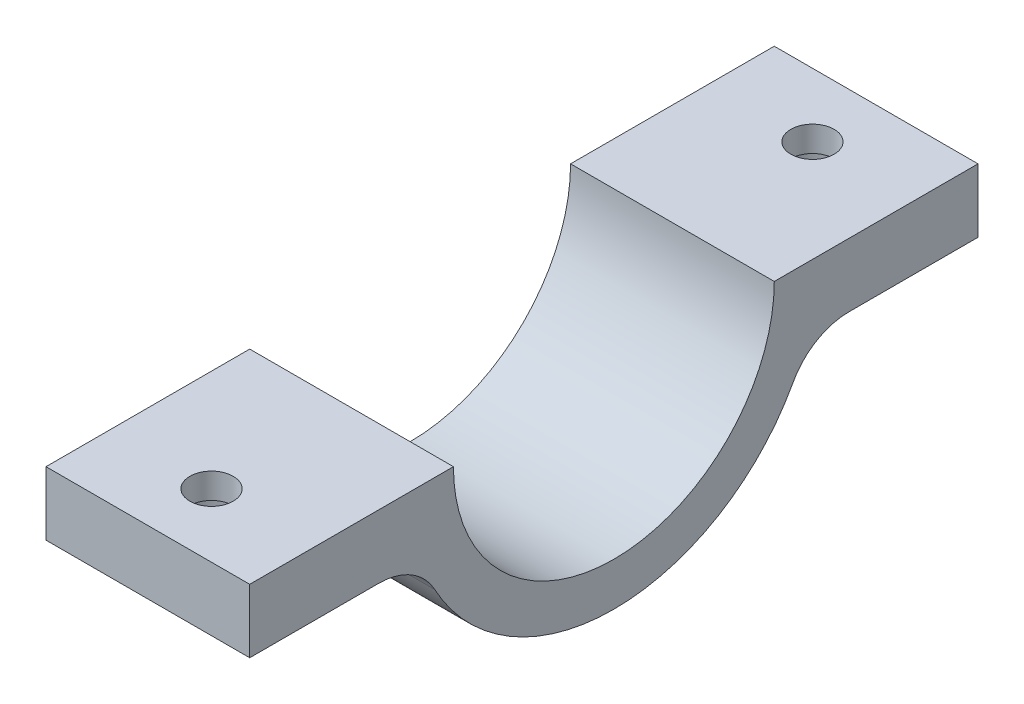
ISO-10303-21;
HEADER;
FILE_DESCRIPTION(('STEP AP214'),'2;1');
FILE_NAME('part.step','',(''),(''),'','','');
FILE_SCHEMA(('AUTOMOTIVE_DESIGN { 1 0 10303 214 1 1 1 1 }'));
ENDSEC;
DATA;
#1=APPLICATION_CONTEXT('core data for automotive mechanical design processes');
#2=APPLICATION_PROTOCOL_DEFINITION('international standard','automotive_design',2000,#1);
#3=PRODUCT_CONTEXT('',#1,'mechanical');
#4=PRODUCT('Part','Part','',(#3));
#5=PRODUCT_RELATED_PRODUCT_CATEGORY('part','',(#4));
#6=PRODUCT_DEFINITION_FORMATION('','',#4);
#7=PRODUCT_DEFINITION_CONTEXT('part definition',#1,'design');
#8=PRODUCT_DEFINITION('design','',#6,#7);
#9=PRODUCT_DEFINITION_SHAPE('','',#8);
#10=(LENGTH_UNIT() NAMED_UNIT(*) SI_UNIT(.MILLI.,.METRE.));
#11=(NAMED_UNIT(*) PLANE_ANGLE_UNIT() SI_UNIT($,.RADIAN.));
#12=(NAMED_UNIT(*) SI_UNIT($,.STERADIAN.) SOLID_ANGLE_UNIT());
#13=UNCERTAINTY_MEASURE_WITH_UNIT(LENGTH_MEASURE(1.E-05),#10,'distance_accuracy_value','');
#14=(GEOMETRIC_REPRESENTATION_CONTEXT(3) GLOBAL_UNCERTAINTY_ASSIGNED_CONTEXT((#13)) GLOBAL_UNIT_ASSIGNED_CONTEXT((#10,
#11,#12)) REPRESENTATION_CONTEXT('',''));
#15=CARTESIAN_POINT('',(0.,0.,0.));
#16=DIRECTION('',(0.,0.,1.));
#17=DIRECTION('',(1.,0.,0.));
#18=AXIS2_PLACEMENT_3D('',#15,#16,#17);
#19=CARTESIAN_POINT('',(8.,0.,0.));
#20=DIRECTION('',(-1.,0.,0.));
#21=DIRECTION('',(0.,0.,1.));
#22=AXIS2_PLACEMENT_3D('',#19,#20,#21);
#23=CYLINDRICAL_SURFACE('',#22,12.6);
#24=CARTESIAN_POINT('',(-8.,0.,0.));
#25=DIRECTION('',(-1.,0.,0.));
#26=DIRECTION('',(0.,0.,1.));
#27=AXIS2_PLACEMENT_3D('',#24,#25,#26);
#28=CIRCLE('',#27,12.6);
#29=CARTESIAN_POINT('',(-8.,0.,-12.6));
#30=VERTEX_POINT('',#29);
#31=CARTESIAN_POINT('',(-8.,0.,12.6));
#32=VERTEX_POINT('',#31);
#33=EDGE_CURVE('E146',#30,#32,#28,.T.);
#34=ORIENTED_EDGE('',*,*,#33,.T.);
#35=DIRECTION('',(-1.,0.,0.));
#36=VECTOR('',#35,1.);
#37=CARTESIAN_POINT('',(8.,0.,12.6));
#38=LINE('',#37,#36);
#39=CARTESIAN_POINT('',(8.,0.,12.6));
#40=VERTEX_POINT('',#39);
#41=EDGE_CURVE('E126',#40,#32,#38,.T.);
#42=ORIENTED_EDGE('',*,*,#41,.F.);
#43=CARTESIAN_POINT('',(8.,0.,0.));
#44=DIRECTION('',(-1.,0.,0.));
#45=DIRECTION('',(0.,0.,1.));
#46=AXIS2_PLACEMENT_3D('',#43,#44,#45);
#47=CIRCLE('',#46,12.6);
#48=CARTESIAN_POINT('',(8.,0.,-12.6));
#49=VERTEX_POINT('',#48);
#50=EDGE_CURVE('E133',#49,#40,#47,.T.);
#51=ORIENTED_EDGE('',*,*,#50,.F.);
#52=DIRECTION('',(-1.,0.,0.));
#53=VECTOR('',#52,1.);
#54=CARTESIAN_POINT('',(8.,0.,-12.6));
#55=LINE('',#54,#53);
#56=EDGE_CURVE('E208',#49,#30,#55,.T.);
#57=ORIENTED_EDGE('',*,*,#56,.T.);
#58=EDGE_LOOP('',(#34,#42,#51,#57));
#59=FACE_BOUND('',#58,.T.);
#60=ADVANCED_FACE('F45',(#59),#23,.F.);
#61=CARTESIAN_POINT('',(8.,0.,12.6));
#62=DIRECTION('',(0.,-1.,0.));
#63=DIRECTION('',(0.,0.,-1.));
#64=AXIS2_PLACEMENT_3D('',#61,#62,#63);
#65=PLANE('',#64);
#66=CARTESIAN_POINT('',(0.,0.,23.6));
#67=DIRECTION('',(0.,-1.,0.));
#68=DIRECTION('',(0.,0.,-1.));
#69=AXIS2_PLACEMENT_3D('',#66,#67,#68);
#70=CIRCLE('',#69,1.7);
#71=CARTESIAN_POINT('',(0.,0.,21.9));
#72=VERTEX_POINT('',#71);
#73=EDGE_CURVE('E268',#72,#72,#70,.T.);
#74=ORIENTED_EDGE('',*,*,#73,.T.);
#75=EDGE_LOOP('',(#74));
#76=FACE_BOUND('',#75,.T.);
#77=DIRECTION('',(0.,0.,1.));
#78=VECTOR('',#77,1.);
#79=CARTESIAN_POINT('',(-8.,0.,12.6));
#80=LINE('',#79,#78);
#81=CARTESIAN_POINT('',(-8.,0.,28.6));
#82=VERTEX_POINT('',#81);
#83=EDGE_CURVE('E211',#32,#82,#80,.T.);
#84=ORIENTED_EDGE('',*,*,#83,.T.);
#85=DIRECTION('',(-1.,0.,0.));
#86=VECTOR('',#85,1.);
#87=CARTESIAN_POINT('',(8.,0.,28.6));
#88=LINE('',#87,#86);
#89=CARTESIAN_POINT('',(8.,0.,28.6));
#90=VERTEX_POINT('',#89);
#91=EDGE_CURVE('E129',#90,#82,#88,.T.);
#92=ORIENTED_EDGE('',*,*,#91,.F.);
#93=DIRECTION('',(0.,0.,1.));
#94=VECTOR('',#93,1.);
#95=CARTESIAN_POINT('',(8.,0.,12.6));
#96=LINE('',#95,#94);
#97=EDGE_CURVE('E122',#40,#90,#96,.T.);
#98=ORIENTED_EDGE('',*,*,#97,.F.);
#99=ORIENTED_EDGE('',*,*,#41,.T.);
#100=EDGE_LOOP('',(#84,#92,#98,#99));
#101=FACE_BOUND('',#100,.T.);
#102=ADVANCED_FACE('F124',(#76,#101),#65,.F.);
#103=CARTESIAN_POINT('',(8.,0.,28.6));
#104=DIRECTION('',(0.,0.,-1.));
#105=DIRECTION('',(-1.,0.,0.));
#106=AXIS2_PLACEMENT_3D('',#103,#104,#105);
#107=PLANE('',#106);
#108=DIRECTION('',(0.,-1.,0.));
#109=VECTOR('',#108,1.);
#110=CARTESIAN_POINT('',(-8.,0.,28.6));
#111=LINE('',#110,#109);
#112=CARTESIAN_POINT('',(-8.,-5.,28.6));
#113=VERTEX_POINT('',#112);
#114=EDGE_CURVE('E215',#82,#113,#111,.T.);
#115=ORIENTED_EDGE('',*,*,#114,.T.);
#116=DIRECTION('',(-1.,0.,0.));
#117=VECTOR('',#116,1.);
#118=CARTESIAN_POINT('',(8.,-5.,28.6));
#119=LINE('',#118,#117);
#120=CARTESIAN_POINT('',(8.,-5.,28.6));
#121=VERTEX_POINT('',#120);
#122=EDGE_CURVE('E154',#121,#113,#119,.T.);
#123=ORIENTED_EDGE('',*,*,#122,.F.);
#124=DIRECTION('',(0.,-1.,0.));
#125=VECTOR('',#124,1.);
#126=CARTESIAN_POINT('',(8.,0.,28.6));
#127=LINE('',#126,#125);
#128=EDGE_CURVE('E132',#90,#121,#127,.T.);
#129=ORIENTED_EDGE('',*,*,#128,.F.);
#130=ORIENTED_EDGE('',*,*,#91,.T.);
#131=EDGE_LOOP('',(#115,#123,#129,#130));
#132=FACE_BOUND('',#131,.T.);
#133=ADVANCED_FACE('F288',(#132),#107,.F.);
#134=CARTESIAN_POINT('',(8.,-5.,28.6));
#135=DIRECTION('',(0.,1.,0.));
#136=DIRECTION('',(0.,0.,1.));
#137=AXIS2_PLACEMENT_3D('',#134,#135,#136);
#138=PLANE('',#137);
#139=CARTESIAN_POINT('',(0.,-5.,23.6));
#140=DIRECTION('',(0.,-1.,0.));
#141=DIRECTION('',(0.,0.,-1.));
#142=AXIS2_PLACEMENT_3D('',#139,#140,#141);
#143=CIRCLE('',#142,3.25);
#144=CARTESIAN_POINT('',(0.,-5.,20.35));
#145=VERTEX_POINT('',#144);
#146=EDGE_CURVE('E280',#145,#145,#143,.T.);
#147=ORIENTED_EDGE('',*,*,#146,.F.);
#148=EDGE_LOOP('',(#147));
#149=FACE_BOUND('',#148,.T.);
#150=DIRECTION('',(0.,0.,-1.));
#151=VECTOR('',#150,1.);
#152=CARTESIAN_POINT('',(-8.,-5.,28.6));
#153=LINE('',#152,#151);
#154=CARTESIAN_POINT('',(-8.,-5.,18.4661853126194));
#155=VERTEX_POINT('',#154);
#156=EDGE_CURVE('E186',#113,#155,#153,.T.);
#157=ORIENTED_EDGE('',*,*,#156,.T.);
#158=DIRECTION('',(1.,0.,0.));
#159=VECTOR('',#158,1.);
#160=CARTESIAN_POINT('',(8.,-5.,18.4661853126194));
#161=LINE('',#160,#159);
#162=CARTESIAN_POINT('',(8.,-5.,18.4661853126194));
#163=VERTEX_POINT('',#162);
#164=EDGE_CURVE('E161',#155,#163,#161,.T.);
#165=ORIENTED_EDGE('',*,*,#164,.T.);
#166=DIRECTION('',(0.,0.,-1.));
#167=VECTOR('',#166,1.);
#168=CARTESIAN_POINT('',(8.,-5.,28.6));
#169=LINE('',#168,#167);
#170=EDGE_CURVE('E202',#121,#163,#169,.T.);
#171=ORIENTED_EDGE('',*,*,#170,.F.);
#172=ORIENTED_EDGE('',*,*,#122,.T.);
#173=EDGE_LOOP('',(#157,#165,#171,#172));
#174=FACE_BOUND('',#173,.T.);
#175=ADVANCED_FACE('F241',(#149,#174),#138,.F.);
#176=CARTESIAN_POINT('',(8.,0.,0.));
#177=DIRECTION('',(-1.,0.,0.));
#178=DIRECTION('',(0.,0.,1.));
#179=AXIS2_PLACEMENT_3D('',#176,#177,#178);
#180=CYLINDRICAL_SURFACE('',#179,16.);
#181=CARTESIAN_POINT('',(8.,0.,0.));
#182=DIRECTION('',(1.,0.,0.));
#183=DIRECTION('',(0.,0.,1.));
#184=AXIS2_PLACEMENT_3D('',#181,#182,#183);
#185=CIRCLE('',#184,16.);
#186=CARTESIAN_POINT('',(8.,-7.61904761904762,14.0694745239005));
#187=VERTEX_POINT('',#186);
#188=CARTESIAN_POINT('',(8.,-7.61904761904762,-14.0694745239005));
#189=VERTEX_POINT('',#188);
#190=EDGE_CURVE('E197',#187,#189,#185,.T.);
#191=ORIENTED_EDGE('',*,*,#190,.F.);
#192=DIRECTION('',(-1.,0.,0.));
#193=VECTOR('',#192,1.);
#194=CARTESIAN_POINT('',(8.,-7.61904761904762,14.0694745239005));
#195=LINE('',#194,#193);
#196=CARTESIAN_POINT('',(-8.,-7.61904761904762,14.0694745239005));
#197=VERTEX_POINT('',#196);
#198=EDGE_CURVE('E152',#187,#197,#195,.T.);
#199=ORIENTED_EDGE('',*,*,#198,.T.);
#200=CARTESIAN_POINT('',(-8.,0.,0.));
#201=DIRECTION('',(1.,0.,0.));
#202=DIRECTION('',(0.,0.,1.));
#203=AXIS2_PLACEMENT_3D('',#200,#201,#202);
#204=CIRCLE('',#203,16.);
#205=CARTESIAN_POINT('',(-8.,-7.61904761904762,-14.0694745239005));
#206=VERTEX_POINT('',#205);
#207=EDGE_CURVE('E178',#197,#206,#204,.T.);
#208=ORIENTED_EDGE('',*,*,#207,.T.);
#209=DIRECTION('',(-1.,0.,0.));
#210=VECTOR('',#209,1.);
#211=CARTESIAN_POINT('',(8.,-7.61904761904762,-14.0694745239005));
#212=LINE('',#211,#210);
#213=EDGE_CURVE('E148',#206,#189,#212,.F.);
#214=ORIENTED_EDGE('',*,*,#213,.T.);
#215=EDGE_LOOP('',(#191,#199,#208,#214));
#216=FACE_BOUND('',#215,.T.);
#217=ADVANCED_FACE('F183',(#216),#180,.T.);
#218=CARTESIAN_POINT('',(8.,-4.99999999999999,-28.6));
#219=DIRECTION('',(0.,1.,0.));
#220=DIRECTION('',(0.,0.,1.));
#221=AXIS2_PLACEMENT_3D('',#218,#219,#220);
#222=PLANE('',#221);
#223=CARTESIAN_POINT('',(0.,-5.,-23.6));
#224=DIRECTION('',(0.,-1.,0.));
#225=DIRECTION('',(0.,0.,-1.));
#226=AXIS2_PLACEMENT_3D('',#223,#224,#225);
#227=CIRCLE('',#226,3.25);
#228=CARTESIAN_POINT('',(0.,-5.,-26.85));
#229=VERTEX_POINT('',#228);
#230=EDGE_CURVE('E264',#229,#229,#227,.T.);
#231=ORIENTED_EDGE('',*,*,#230,.F.);
#232=EDGE_LOOP('',(#231));
#233=FACE_BOUND('',#232,.T.);
#234=DIRECTION('',(0.,0.,-1.));
#235=VECTOR('',#234,1.);
#236=CARTESIAN_POINT('',(8.,-4.99999999999999,-28.6));
#237=LINE('',#236,#235);
#238=CARTESIAN_POINT('',(8.,-5.,-18.4661853126194));
#239=VERTEX_POINT('',#238);
#240=CARTESIAN_POINT('',(8.,-4.99999999999999,-28.6));
#241=VERTEX_POINT('',#240);
#242=EDGE_CURVE('E192',#239,#241,#237,.T.);
#243=ORIENTED_EDGE('',*,*,#242,.F.);
#244=DIRECTION('',(1.,0.,0.));
#245=VECTOR('',#244,1.);
#246=CARTESIAN_POINT('',(-8.,-5.,-18.4661853126194));
#247=LINE('',#246,#245);
#248=CARTESIAN_POINT('',(-8.,-5.,-18.4661853126194));
#249=VERTEX_POINT('',#248);
#250=EDGE_CURVE('E164',#239,#249,#247,.F.);
#251=ORIENTED_EDGE('',*,*,#250,.T.);
#252=DIRECTION('',(0.,0.,-1.));
#253=VECTOR('',#252,1.);
#254=CARTESIAN_POINT('',(-8.,-4.99999999999999,-28.6));
#255=LINE('',#254,#253);
#256=CARTESIAN_POINT('',(-8.,-4.99999999999999,-28.6));
#257=VERTEX_POINT('',#256);
#258=EDGE_CURVE('E180',#249,#257,#255,.T.);
#259=ORIENTED_EDGE('',*,*,#258,.T.);
#260=DIRECTION('',(-1.,0.,0.));
#261=VECTOR('',#260,1.);
#262=CARTESIAN_POINT('',(8.,-4.99999999999999,-28.6));
#263=LINE('',#262,#261);
#264=EDGE_CURVE('E193',#241,#257,#263,.T.);
#265=ORIENTED_EDGE('',*,*,#264,.F.);
#266=EDGE_LOOP('',(#243,#251,#259,#265));
#267=FACE_BOUND('',#266,.T.);
#268=ADVANCED_FACE('F189',(#233,#267),#222,.F.);
#269=CARTESIAN_POINT('',(8.,0.,-28.6));
#270=DIRECTION('',(0.,0.,1.));
#271=DIRECTION('',(1.,0.,0.));
#272=AXIS2_PLACEMENT_3D('',#269,#270,#271);
#273=PLANE('',#272);
#274=DIRECTION('',(0.,1.,0.));
#275=VECTOR('',#274,1.);
#276=CARTESIAN_POINT('',(-8.,0.,-28.6));
#277=LINE('',#276,#275);
#278=CARTESIAN_POINT('',(-8.,0.,-28.6));
#279=VERTEX_POINT('',#278);
#280=EDGE_CURVE('E223',#257,#279,#277,.T.);
#281=ORIENTED_EDGE('',*,*,#280,.T.);
#282=DIRECTION('',(-1.,0.,0.));
#283=VECTOR('',#282,1.);
#284=CARTESIAN_POINT('',(8.,0.,-28.6));
#285=LINE('',#284,#283);
#286=CARTESIAN_POINT('',(8.,0.,-28.6));
#287=VERTEX_POINT('',#286);
#288=EDGE_CURVE('E230',#287,#279,#285,.T.);
#289=ORIENTED_EDGE('',*,*,#288,.F.);
#290=DIRECTION('',(0.,1.,0.));
#291=VECTOR('',#290,1.);
#292=CARTESIAN_POINT('',(8.,0.,-28.6));
#293=LINE('',#292,#291);
#294=EDGE_CURVE('E196',#241,#287,#293,.T.);
#295=ORIENTED_EDGE('',*,*,#294,.F.);
#296=ORIENTED_EDGE('',*,*,#264,.T.);
#297=EDGE_LOOP('',(#281,#289,#295,#296));
#298=FACE_BOUND('',#297,.T.);
#299=ADVANCED_FACE('F320',(#298),#273,.F.);
#300=CARTESIAN_POINT('',(8.,0.,-12.6));
#301=DIRECTION('',(0.,-1.,0.));
#302=DIRECTION('',(0.,0.,-1.));
#303=AXIS2_PLACEMENT_3D('',#300,#301,#302);
#304=PLANE('',#303);
#305=CARTESIAN_POINT('',(0.,0.,-23.6));
#306=DIRECTION('',(0.,-1.,0.));
#307=DIRECTION('',(0.,0.,-1.));
#308=AXIS2_PLACEMENT_3D('',#305,#306,#307);
#309=CIRCLE('',#308,1.7);
#310=CARTESIAN_POINT('',(0.,0.,-25.3));
#311=VERTEX_POINT('',#310);
#312=EDGE_CURVE('E212',#311,#311,#309,.T.);
#313=ORIENTED_EDGE('',*,*,#312,.T.);
#314=EDGE_LOOP('',(#313));
#315=FACE_BOUND('',#314,.T.);
#316=DIRECTION('',(0.,0.,1.));
#317=VECTOR('',#316,1.);
#318=CARTESIAN_POINT('',(-8.,0.,-12.6));
#319=LINE('',#318,#317);
#320=EDGE_CURVE('E143',#279,#30,#319,.T.);
#321=ORIENTED_EDGE('',*,*,#320,.T.);
#322=ORIENTED_EDGE('',*,*,#56,.F.);
#323=DIRECTION('',(0.,0.,1.));
#324=VECTOR('',#323,1.);
#325=CARTESIAN_POINT('',(8.,0.,-12.6));
#326=LINE('',#325,#324);
#327=EDGE_CURVE('E138',#287,#49,#326,.T.);
#328=ORIENTED_EDGE('',*,*,#327,.F.);
#329=ORIENTED_EDGE('',*,*,#288,.T.);
#330=EDGE_LOOP('',(#321,#322,#328,#329));
#331=FACE_BOUND('',#330,.T.);
#332=ADVANCED_FACE('F314',(#315,#331),#304,.F.);
#333=CARTESIAN_POINT('',(8.,0.,0.));
#334=DIRECTION('',(-1.,0.,0.));
#335=DIRECTION('',(0.,0.,1.));
#336=AXIS2_PLACEMENT_3D('',#333,#334,#335);
#337=PLANE('',#336);
#338=ORIENTED_EDGE('',*,*,#50,.T.);
#339=ORIENTED_EDGE('',*,*,#97,.T.);
#340=ORIENTED_EDGE('',*,*,#128,.T.);
#341=ORIENTED_EDGE('',*,*,#170,.T.);
#342=CARTESIAN_POINT('',(8.,-10.,18.4661853126194));
#343=DIRECTION('',(-1.,0.,0.));
#344=DIRECTION('',(0.,0.,1.));
#345=AXIS2_PLACEMENT_3D('',#342,#343,#344);
#346=CIRCLE('',#345,5.);
#347=EDGE_CURVE('E170',#163,#187,#346,.T.);
#348=ORIENTED_EDGE('',*,*,#347,.T.);
#349=ORIENTED_EDGE('',*,*,#190,.T.);
#350=CARTESIAN_POINT('',(8.,-9.99999999999999,-18.4661853126194));
#351=DIRECTION('',(-1.,0.,0.));
#352=DIRECTION('',(0.,0.,1.));
#353=AXIS2_PLACEMENT_3D('',#350,#351,#352);
#354=CIRCLE('',#353,5.);
#355=EDGE_CURVE('E11',#189,#239,#354,.T.);
#356=ORIENTED_EDGE('',*,*,#355,.T.);
#357=ORIENTED_EDGE('',*,*,#242,.T.);
#358=ORIENTED_EDGE('',*,*,#294,.T.);
#359=ORIENTED_EDGE('',*,*,#327,.T.);
#360=EDGE_LOOP('',(#338,#339,#340,#341,#348,#349,#356,#357,#358,#359));
#361=FACE_BOUND('',#360,.T.);
#362=ADVANCED_FACE('F136',(#361),#337,.F.);
#363=CARTESIAN_POINT('',(-8.,0.,0.));
#364=DIRECTION('',(-1.,0.,0.));
#365=DIRECTION('',(0.,0.,1.));
#366=AXIS2_PLACEMENT_3D('',#363,#364,#365);
#367=PLANE('',#366);
#368=ORIENTED_EDGE('',*,*,#33,.F.);
#369=ORIENTED_EDGE('',*,*,#320,.F.);
#370=ORIENTED_EDGE('',*,*,#280,.F.);
#371=ORIENTED_EDGE('',*,*,#258,.F.);
#372=CARTESIAN_POINT('',(-8.,-9.99999999999999,-18.4661853126194));
#373=DIRECTION('',(-1.,0.,0.));
#374=DIRECTION('',(0.,0.,1.));
#375=AXIS2_PLACEMENT_3D('',#372,#373,#374);
#376=CIRCLE('',#375,5.);
#377=EDGE_CURVE('E54',#249,#206,#376,.F.);
#378=ORIENTED_EDGE('',*,*,#377,.T.);
#379=ORIENTED_EDGE('',*,*,#207,.F.);
#380=CARTESIAN_POINT('',(-8.,-10.,18.4661853126194));
#381=DIRECTION('',(-1.,0.,0.));
#382=DIRECTION('',(0.,0.,1.));
#383=AXIS2_PLACEMENT_3D('',#380,#381,#382);
#384=CIRCLE('',#383,5.);
#385=EDGE_CURVE('E167',#197,#155,#384,.F.);
#386=ORIENTED_EDGE('',*,*,#385,.T.);
#387=ORIENTED_EDGE('',*,*,#156,.F.);
#388=ORIENTED_EDGE('',*,*,#114,.F.);
#389=ORIENTED_EDGE('',*,*,#83,.F.);
#390=EDGE_LOOP('',(#368,#369,#370,#371,#378,#379,#386,#387,#388,#389));
#391=FACE_BOUND('',#390,.T.);
#392=ADVANCED_FACE('F177',(#391),#367,.T.);
#393=CARTESIAN_POINT('',(8.,-10.,18.4661853126194));
#394=DIRECTION('',(-1.,0.,0.));
#395=DIRECTION('',(0.,0.,1.));
#396=AXIS2_PLACEMENT_3D('',#393,#394,#395);
#397=CYLINDRICAL_SURFACE('',#396,5.);
#398=ORIENTED_EDGE('',*,*,#347,.F.);
#399=ORIENTED_EDGE('',*,*,#164,.F.);
#400=ORIENTED_EDGE('',*,*,#385,.F.);
#401=ORIENTED_EDGE('',*,*,#198,.F.);
#402=EDGE_LOOP('',(#398,#399,#400,#401));
#403=FACE_BOUND('',#402,.T.);
#404=ADVANCED_FACE('F248',(#403),#397,.F.);
#405=CARTESIAN_POINT('',(8.,-9.99999999999999,-18.4661853126194));
#406=DIRECTION('',(-1.,0.,0.));
#407=DIRECTION('',(0.,0.,1.));
#408=AXIS2_PLACEMENT_3D('',#405,#406,#407);
#409=CYLINDRICAL_SURFACE('',#408,5.);
#410=ORIENTED_EDGE('',*,*,#355,.F.);
#411=ORIENTED_EDGE('',*,*,#213,.F.);
#412=ORIENTED_EDGE('',*,*,#377,.F.);
#413=ORIENTED_EDGE('',*,*,#250,.F.);
#414=EDGE_LOOP('',(#410,#411,#412,#413));
#415=FACE_BOUND('',#414,.T.);
#416=ADVANCED_FACE('F47',(#415),#409,.F.);
#417=CARTESIAN_POINT('',(0.,-5.,-23.6));
#418=DIRECTION('',(0.,-1.,0.));
#419=DIRECTION('',(0.,0.,-1.));
#420=AXIS2_PLACEMENT_3D('',#417,#418,#419);
#421=CYLINDRICAL_SURFACE('',#420,1.7);
#422=ORIENTED_EDGE('',*,*,#312,.F.);
#423=EDGE_LOOP('',(#422));
#424=FACE_BOUND('',#423,.T.);
#425=CARTESIAN_POINT('',(0.,-2.,-23.6));
#426=DIRECTION('',(0.,-1.,0.));
#427=DIRECTION('',(0.,0.,-1.));
#428=AXIS2_PLACEMENT_3D('',#425,#426,#427);
#429=CIRCLE('',#428,1.7);
#430=CARTESIAN_POINT('',(0.,-2.,-25.3));
#431=VERTEX_POINT('',#430);
#432=EDGE_CURVE('E256',#431,#431,#429,.T.);
#433=ORIENTED_EDGE('',*,*,#432,.T.);
#434=EDGE_LOOP('',(#433));
#435=FACE_BOUND('',#434,.T.);
#436=ADVANCED_FACE('F309',(#424,#435),#421,.F.);
#437=CARTESIAN_POINT('',(1.7,-2.,-23.6));
#438=DIRECTION('',(0.,1.,0.));
#439=DIRECTION('',(0.,0.,1.));
#440=AXIS2_PLACEMENT_3D('',#437,#438,#439);
#441=PLANE('',#440);
#442=ORIENTED_EDGE('',*,*,#432,.F.);
#443=EDGE_LOOP('',(#442));
#444=FACE_BOUND('',#443,.T.);
#445=CARTESIAN_POINT('',(0.,-2.,-23.6));
#446=DIRECTION('',(0.,-1.,0.));
#447=DIRECTION('',(0.,0.,-1.));
#448=AXIS2_PLACEMENT_3D('',#445,#446,#447);
#449=CIRCLE('',#448,3.25);
#450=CARTESIAN_POINT('',(0.,-2.,-26.85));
#451=VERTEX_POINT('',#450);
#452=EDGE_CURVE('E260',#451,#451,#449,.T.);
#453=ORIENTED_EDGE('',*,*,#452,.T.);
#454=EDGE_LOOP('',(#453));
#455=FACE_BOUND('',#454,.T.);
#456=ADVANCED_FACE('F333',(#444,#455),#441,.F.);
#457=CARTESIAN_POINT('',(0.,-5.,-23.6));
#458=DIRECTION('',(0.,-1.,0.));
#459=DIRECTION('',(0.,0.,-1.));
#460=AXIS2_PLACEMENT_3D('',#457,#458,#459);
#461=CYLINDRICAL_SURFACE('',#460,3.25);
#462=ORIENTED_EDGE('',*,*,#452,.F.);
#463=EDGE_LOOP('',(#462));
#464=FACE_BOUND('',#463,.T.);
#465=ORIENTED_EDGE('',*,*,#230,.T.);
#466=EDGE_LOOP('',(#465));
#467=FACE_BOUND('',#466,.T.);
#468=ADVANCED_FACE('F330',(#464,#467),#461,.F.);
#469=CARTESIAN_POINT('',(0.,-5.,23.6));
#470=DIRECTION('',(0.,-1.,0.));
#471=DIRECTION('',(0.,0.,-1.));
#472=AXIS2_PLACEMENT_3D('',#469,#470,#471);
#473=CYLINDRICAL_SURFACE('',#472,1.7);
#474=ORIENTED_EDGE('',*,*,#73,.F.);
#475=EDGE_LOOP('',(#474));
#476=FACE_BOUND('',#475,.T.);
#477=CARTESIAN_POINT('',(0.,-2.,23.6));
#478=DIRECTION('',(0.,-1.,0.));
#479=DIRECTION('',(0.,0.,-1.));
#480=AXIS2_PLACEMENT_3D('',#477,#478,#479);
#481=CIRCLE('',#480,1.7);
#482=CARTESIAN_POINT('',(0.,-2.,21.9));
#483=VERTEX_POINT('',#482);
#484=EDGE_CURVE('E272',#483,#483,#481,.T.);
#485=ORIENTED_EDGE('',*,*,#484,.T.);
#486=EDGE_LOOP('',(#485));
#487=FACE_BOUND('',#486,.T.);
#488=ADVANCED_FACE('F332',(#476,#487),#473,.F.);
#489=CARTESIAN_POINT('',(1.7,-2.,23.6));
#490=DIRECTION('',(0.,1.,0.));
#491=DIRECTION('',(0.,0.,1.));
#492=AXIS2_PLACEMENT_3D('',#489,#490,#491);
#493=PLANE('',#492);
#494=ORIENTED_EDGE('',*,*,#484,.F.);
#495=EDGE_LOOP('',(#494));
#496=FACE_BOUND('',#495,.T.);
#497=CARTESIAN_POINT('',(0.,-2.,23.6));
#498=DIRECTION('',(0.,-1.,0.));
#499=DIRECTION('',(0.,0.,-1.));
#500=AXIS2_PLACEMENT_3D('',#497,#498,#499);
#501=CIRCLE('',#500,3.25);
#502=CARTESIAN_POINT('',(0.,-2.,20.35));
#503=VERTEX_POINT('',#502);
#504=EDGE_CURVE('E276',#503,#503,#501,.T.);
#505=ORIENTED_EDGE('',*,*,#504,.T.);
#506=EDGE_LOOP('',(#505));
#507=FACE_BOUND('',#506,.T.);
#508=ADVANCED_FACE('F340',(#496,#507),#493,.F.);
#509=CARTESIAN_POINT('',(0.,-5.,23.6));
#510=DIRECTION('',(0.,-1.,0.));
#511=DIRECTION('',(0.,0.,-1.));
#512=AXIS2_PLACEMENT_3D('',#509,#510,#511);
#513=CYLINDRICAL_SURFACE('',#512,3.25);
#514=ORIENTED_EDGE('',*,*,#504,.F.);
#515=EDGE_LOOP('',(#514));
#516=FACE_BOUND('',#515,.T.);
#517=ORIENTED_EDGE('',*,*,#146,.T.);
#518=EDGE_LOOP('',(#517));
#519=FACE_BOUND('',#518,.T.);
#520=ADVANCED_FACE('F285',(#516,#519),#513,.F.);
#521=CLOSED_SHELL('',(#60,#102,#133,#175,#217,#268,#299,#332,#362,#392,#404,#416,#436,#456,#468,
#488,#508,#520));
#522=MANIFOLD_SOLID_BREP('B2',#521);
#523=ADVANCED_BREP_SHAPE_REPRESENTATION('',(#18,#522),#14);
#524=SHAPE_DEFINITION_REPRESENTATION(#9,#523);
ENDSEC;
END-ISO-10303-21;
